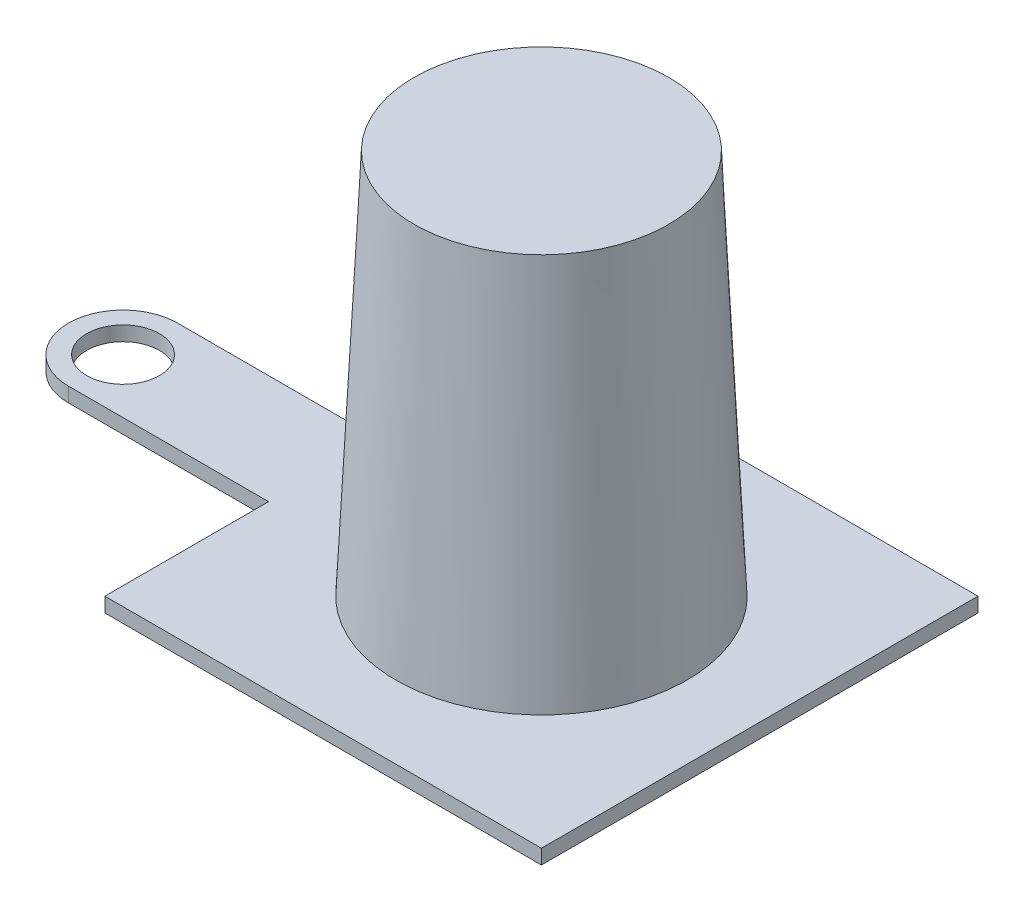
ISO-10303-21;
HEADER;
FILE_DESCRIPTION(('STEP AP214'),'2;1');
FILE_NAME('part.step','',(''),(''),'','','');
FILE_SCHEMA(('AUTOMOTIVE_DESIGN { 1 0 10303 214 1 1 1 1 }'));
ENDSEC;
DATA;
#1=APPLICATION_CONTEXT('core data for automotive mechanical design processes');
#2=APPLICATION_PROTOCOL_DEFINITION('international standard','automotive_design',2000,#1);
#3=PRODUCT_CONTEXT('',#1,'mechanical');
#4=PRODUCT('Part','Part','',(#3));
#5=PRODUCT_RELATED_PRODUCT_CATEGORY('part','',(#4));
#6=PRODUCT_DEFINITION_FORMATION('','',#4);
#7=PRODUCT_DEFINITION_CONTEXT('part definition',#1,'design');
#8=PRODUCT_DEFINITION('design','',#6,#7);
#9=PRODUCT_DEFINITION_SHAPE('','',#8);
#10=(LENGTH_UNIT() NAMED_UNIT(*) SI_UNIT(.MILLI.,.METRE.));
#11=(NAMED_UNIT(*) PLANE_ANGLE_UNIT() SI_UNIT($,.RADIAN.));
#12=(NAMED_UNIT(*) SI_UNIT($,.STERADIAN.) SOLID_ANGLE_UNIT());
#13=UNCERTAINTY_MEASURE_WITH_UNIT(LENGTH_MEASURE(1.E-05),#10,'distance_accuracy_value','');
#14=(GEOMETRIC_REPRESENTATION_CONTEXT(3) GLOBAL_UNCERTAINTY_ASSIGNED_CONTEXT((#13)) GLOBAL_UNIT_ASSIGNED_CONTEXT((#10,
#11,#12)) REPRESENTATION_CONTEXT('',''));
#15=CARTESIAN_POINT('',(0.,0.,0.));
#16=DIRECTION('',(0.,0.,1.));
#17=DIRECTION('',(1.,0.,0.));
#18=AXIS2_PLACEMENT_3D('',#15,#16,#17);
#19=CARTESIAN_POINT('',(6.,0.4,6.));
#20=DIRECTION('',(-1.,0.,0.));
#21=DIRECTION('',(0.,0.,1.));
#22=AXIS2_PLACEMENT_3D('',#19,#20,#21);
#23=PLANE('',#22);
#24=DIRECTION('',(0.,0.,-1.));
#25=VECTOR('',#24,1.);
#26=CARTESIAN_POINT('',(6.,0.,6.));
#27=LINE('',#26,#25);
#28=CARTESIAN_POINT('',(6.,0.,6.));
#29=VERTEX_POINT('',#28);
#30=CARTESIAN_POINT('',(6.,0.,-6.));
#31=VERTEX_POINT('',#30);
#32=EDGE_CURVE('E185',#29,#31,#27,.T.);
#33=ORIENTED_EDGE('',*,*,#32,.T.);
#34=DIRECTION('',(0.,-1.,0.));
#35=VECTOR('',#34,1.);
#36=CARTESIAN_POINT('',(6.,0.4,-6.));
#37=LINE('',#36,#35);
#38=CARTESIAN_POINT('',(6.,0.4,-6.));
#39=VERTEX_POINT('',#38);
#40=EDGE_CURVE('E166',#39,#31,#37,.T.);
#41=ORIENTED_EDGE('',*,*,#40,.F.);
#42=DIRECTION('',(0.,0.,-1.));
#43=VECTOR('',#42,1.);
#44=CARTESIAN_POINT('',(6.,0.4,6.));
#45=LINE('',#44,#43);
#46=CARTESIAN_POINT('',(6.,0.4,6.));
#47=VERTEX_POINT('',#46);
#48=EDGE_CURVE('E172',#47,#39,#45,.T.);
#49=ORIENTED_EDGE('',*,*,#48,.F.);
#50=DIRECTION('',(0.,-1.,0.));
#51=VECTOR('',#50,1.);
#52=CARTESIAN_POINT('',(6.,0.4,6.));
#53=LINE('',#52,#51);
#54=EDGE_CURVE('E192',#47,#29,#53,.T.);
#55=ORIENTED_EDGE('',*,*,#54,.T.);
#56=EDGE_LOOP('',(#33,#41,#49,#55));
#57=FACE_BOUND('',#56,.T.);
#58=ADVANCED_FACE('F77',(#57),#23,.F.);
#59=CARTESIAN_POINT('',(-6.,0.4,-6.));
#60=DIRECTION('',(0.,0.,-1.));
#61=DIRECTION('',(-1.,0.,0.));
#62=AXIS2_PLACEMENT_3D('',#59,#60,#61);
#63=PLANE('',#62);
#64=DIRECTION('',(1.,0.,0.));
#65=VECTOR('',#64,1.);
#66=CARTESIAN_POINT('',(-6.,0.,-6.));
#67=LINE('',#66,#65);
#68=CARTESIAN_POINT('',(-6.,0.,-6.));
#69=VERTEX_POINT('',#68);
#70=EDGE_CURVE('E165',#69,#31,#67,.T.);
#71=ORIENTED_EDGE('',*,*,#70,.F.);
#72=DIRECTION('',(0.,-1.,0.));
#73=VECTOR('',#72,1.);
#74=CARTESIAN_POINT('',(-6.,0.4,-6.));
#75=LINE('',#74,#73);
#76=CARTESIAN_POINT('',(-6.,0.4,-6.));
#77=VERTEX_POINT('',#76);
#78=EDGE_CURVE('E153',#77,#69,#75,.T.);
#79=ORIENTED_EDGE('',*,*,#78,.F.);
#80=DIRECTION('',(1.,0.,0.));
#81=VECTOR('',#80,1.);
#82=CARTESIAN_POINT('',(-6.,0.4,-6.));
#83=LINE('',#82,#81);
#84=EDGE_CURVE('E163',#77,#39,#83,.T.);
#85=ORIENTED_EDGE('',*,*,#84,.T.);
#86=ORIENTED_EDGE('',*,*,#40,.T.);
#87=EDGE_LOOP('',(#71,#79,#85,#86));
#88=FACE_BOUND('',#87,.T.);
#89=ADVANCED_FACE('F162',(#88),#63,.T.);
#90=CARTESIAN_POINT('',(-6.,0.4,6.));
#91=DIRECTION('',(0.,0.,-1.));
#92=DIRECTION('',(-1.,0.,0.));
#93=AXIS2_PLACEMENT_3D('',#90,#91,#92);
#94=PLANE('',#93);
#95=DIRECTION('',(1.,0.,0.));
#96=VECTOR('',#95,1.);
#97=CARTESIAN_POINT('',(-6.,0.,6.));
#98=LINE('',#97,#96);
#99=CARTESIAN_POINT('',(-6.,0.,6.));
#100=VERTEX_POINT('',#99);
#101=EDGE_CURVE('E158',#100,#29,#98,.T.);
#102=ORIENTED_EDGE('',*,*,#101,.T.);
#103=ORIENTED_EDGE('',*,*,#54,.F.);
#104=DIRECTION('',(1.,0.,0.));
#105=VECTOR('',#104,1.);
#106=CARTESIAN_POINT('',(-6.,0.4,6.));
#107=LINE('',#106,#105);
#108=CARTESIAN_POINT('',(-6.,0.4,6.));
#109=VERTEX_POINT('',#108);
#110=EDGE_CURVE('E167',#109,#47,#107,.T.);
#111=ORIENTED_EDGE('',*,*,#110,.F.);
#112=DIRECTION('',(0.,-1.,0.));
#113=VECTOR('',#112,1.);
#114=CARTESIAN_POINT('',(-6.,0.4,6.));
#115=LINE('',#114,#113);
#116=EDGE_CURVE('E189',#109,#100,#115,.T.);
#117=ORIENTED_EDGE('',*,*,#116,.T.);
#118=EDGE_LOOP('',(#102,#103,#111,#117));
#119=FACE_BOUND('',#118,.T.);
#120=ADVANCED_FACE('F259',(#119),#94,.F.);
#121=CARTESIAN_POINT('',(0.,0.,0.));
#122=DIRECTION('',(0.,-1.,0.));
#123=DIRECTION('',(0.,0.,-1.));
#124=AXIS2_PLACEMENT_3D('',#121,#122,#123);
#125=PLANE('',#124);
#126=DIRECTION('',(-1.,0.,0.));
#127=VECTOR('',#126,1.);
#128=CARTESIAN_POINT('',(-6.,0.,1.5));
#129=LINE('',#128,#127);
#130=CARTESIAN_POINT('',(-6.,0.,1.5));
#131=VERTEX_POINT('',#130);
#132=CARTESIAN_POINT('',(-11.5,0.,1.5));
#133=VERTEX_POINT('',#132);
#134=EDGE_CURVE('E199',#131,#133,#129,.T.);
#135=ORIENTED_EDGE('',*,*,#134,.T.);
#136=CARTESIAN_POINT('',(-11.5,0.,0.));
#137=DIRECTION('',(0.,-1.,0.));
#138=DIRECTION('',(0.,0.,-1.));
#139=AXIS2_PLACEMENT_3D('',#136,#137,#138);
#140=CIRCLE('',#139,1.5);
#141=CARTESIAN_POINT('',(-13.,0.,0.));
#142=VERTEX_POINT('',#141);
#143=EDGE_CURVE('E225',#133,#142,#140,.T.);
#144=ORIENTED_EDGE('',*,*,#143,.T.);
#145=CARTESIAN_POINT('',(-11.5,0.,0.));
#146=DIRECTION('',(0.,-1.,0.));
#147=DIRECTION('',(0.,0.,-1.));
#148=AXIS2_PLACEMENT_3D('',#145,#146,#147);
#149=CIRCLE('',#148,1.5);
#150=CARTESIAN_POINT('',(-11.5,0.,-1.5));
#151=VERTEX_POINT('',#150);
#152=EDGE_CURVE('E223',#142,#151,#149,.T.);
#153=ORIENTED_EDGE('',*,*,#152,.T.);
#154=DIRECTION('',(-1.,0.,0.));
#155=VECTOR('',#154,1.);
#156=CARTESIAN_POINT('',(-6.,0.,-1.5));
#157=LINE('',#156,#155);
#158=CARTESIAN_POINT('',(-6.,0.,-1.5));
#159=VERTEX_POINT('',#158);
#160=EDGE_CURVE('E208',#159,#151,#157,.T.);
#161=ORIENTED_EDGE('',*,*,#160,.F.);
#162=DIRECTION('',(0.,0.,-1.));
#163=VECTOR('',#162,1.);
#164=CARTESIAN_POINT('',(-6.,0.,6.));
#165=LINE('',#164,#163);
#166=EDGE_CURVE('E183',#159,#69,#165,.T.);
#167=ORIENTED_EDGE('',*,*,#166,.T.);
#168=ORIENTED_EDGE('',*,*,#70,.T.);
#169=ORIENTED_EDGE('',*,*,#32,.F.);
#170=ORIENTED_EDGE('',*,*,#101,.F.);
#171=EDGE_CURVE('E180',#100,#131,#165,.T.);
#172=ORIENTED_EDGE('',*,*,#171,.T.);
#173=EDGE_LOOP('',(#135,#144,#153,#161,#167,#168,#169,#170,#172));
#174=FACE_BOUND('',#173,.T.);
#175=CARTESIAN_POINT('',(-11.5,0.,0.));
#176=DIRECTION('',(0.,1.,0.));
#177=DIRECTION('',(0.,0.,1.));
#178=AXIS2_PLACEMENT_3D('',#175,#176,#177);
#179=CIRCLE('',#178,1.);
#180=CARTESIAN_POINT('',(-11.5,0.,1.));
#181=VERTEX_POINT('',#180);
#182=EDGE_CURVE('E200',#181,#181,#179,.T.);
#183=ORIENTED_EDGE('',*,*,#182,.T.);
#184=EDGE_LOOP('',(#183));
#185=FACE_BOUND('',#184,.T.);
#186=ADVANCED_FACE('F240',(#174,#185),#125,.T.);
#187=CARTESIAN_POINT('',(0.,0.4,0.));
#188=DIRECTION('',(0.,-1.,0.));
#189=DIRECTION('',(0.,0.,-1.));
#190=AXIS2_PLACEMENT_3D('',#187,#188,#189);
#191=PLANE('',#190);
#192=CARTESIAN_POINT('',(0.,0.399999999999999,0.));
#193=DIRECTION('',(0.,-1.,0.));
#194=DIRECTION('',(0.,0.,-1.));
#195=AXIS2_PLACEMENT_3D('',#192,#193,#194);
#196=CIRCLE('',#195,4.);
#197=CARTESIAN_POINT('',(0.,0.399999999999999,-4.));
#198=VERTEX_POINT('',#197);
#199=EDGE_CURVE('E216',#198,#198,#196,.T.);
#200=ORIENTED_EDGE('',*,*,#199,.T.);
#201=EDGE_LOOP('',(#200));
#202=FACE_BOUND('',#201,.T.);
#203=CARTESIAN_POINT('',(-11.5,0.4,0.));
#204=DIRECTION('',(0.,-1.,0.));
#205=DIRECTION('',(0.,0.,-1.));
#206=AXIS2_PLACEMENT_3D('',#203,#204,#205);
#207=CIRCLE('',#206,1.5);
#208=CARTESIAN_POINT('',(-11.5,0.4,-1.5));
#209=VERTEX_POINT('',#208);
#210=CARTESIAN_POINT('',(-13.,0.4,0.));
#211=VERTEX_POINT('',#210);
#212=EDGE_CURVE('E93',#209,#211,#207,.F.);
#213=ORIENTED_EDGE('',*,*,#212,.T.);
#214=CARTESIAN_POINT('',(-11.5,0.4,0.));
#215=DIRECTION('',(0.,-1.,0.));
#216=DIRECTION('',(0.,0.,-1.));
#217=AXIS2_PLACEMENT_3D('',#214,#215,#216);
#218=CIRCLE('',#217,1.5);
#219=CARTESIAN_POINT('',(-11.5,0.4,1.5));
#220=VERTEX_POINT('',#219);
#221=EDGE_CURVE('E86',#211,#220,#218,.F.);
#222=ORIENTED_EDGE('',*,*,#221,.T.);
#223=DIRECTION('',(-1.,0.,0.));
#224=VECTOR('',#223,1.);
#225=CARTESIAN_POINT('',(-6.,0.4,1.5));
#226=LINE('',#225,#224);
#227=CARTESIAN_POINT('',(-6.,0.4,1.5));
#228=VERTEX_POINT('',#227);
#229=EDGE_CURVE('E204',#228,#220,#226,.T.);
#230=ORIENTED_EDGE('',*,*,#229,.F.);
#231=DIRECTION('',(0.,0.,-1.));
#232=VECTOR('',#231,1.);
#233=CARTESIAN_POINT('',(-6.,0.4,6.));
#234=LINE('',#233,#232);
#235=EDGE_CURVE('E157',#109,#228,#234,.T.);
#236=ORIENTED_EDGE('',*,*,#235,.F.);
#237=ORIENTED_EDGE('',*,*,#110,.T.);
#238=ORIENTED_EDGE('',*,*,#48,.T.);
#239=ORIENTED_EDGE('',*,*,#84,.F.);
#240=CARTESIAN_POINT('',(-6.,0.4,-1.5));
#241=VERTEX_POINT('',#240);
#242=EDGE_CURVE('E149',#241,#77,#234,.T.);
#243=ORIENTED_EDGE('',*,*,#242,.F.);
#244=DIRECTION('',(-1.,0.,0.));
#245=VECTOR('',#244,1.);
#246=CARTESIAN_POINT('',(-6.,0.4,-1.5));
#247=LINE('',#246,#245);
#248=EDGE_CURVE('E207',#241,#209,#247,.T.);
#249=ORIENTED_EDGE('',*,*,#248,.T.);
#250=EDGE_LOOP('',(#213,#222,#230,#236,#237,#238,#239,#243,#249));
#251=FACE_BOUND('',#250,.T.);
#252=CARTESIAN_POINT('',(-11.5,0.4,0.));
#253=DIRECTION('',(0.,1.,0.));
#254=DIRECTION('',(0.,0.,1.));
#255=AXIS2_PLACEMENT_3D('',#252,#253,#254);
#256=CIRCLE('',#255,1.);
#257=CARTESIAN_POINT('',(-11.5,0.4,1.));
#258=VERTEX_POINT('',#257);
#259=EDGE_CURVE('E196',#258,#258,#256,.T.);
#260=ORIENTED_EDGE('',*,*,#259,.F.);
#261=EDGE_LOOP('',(#260));
#262=FACE_BOUND('',#261,.T.);
#263=ADVANCED_FACE('F169',(#202,#251,#262),#191,.F.);
#264=CARTESIAN_POINT('',(-6.,0.4,6.));
#265=DIRECTION('',(-1.,0.,0.));
#266=DIRECTION('',(0.,0.,1.));
#267=AXIS2_PLACEMENT_3D('',#264,#265,#266);
#268=PLANE('',#267);
#269=ORIENTED_EDGE('',*,*,#235,.T.);
#270=DIRECTION('',(0.,-1.,0.));
#271=VECTOR('',#270,1.);
#272=CARTESIAN_POINT('',(-6.,0.4,1.5));
#273=LINE('',#272,#271);
#274=EDGE_CURVE('E191',#228,#131,#273,.T.);
#275=ORIENTED_EDGE('',*,*,#274,.T.);
#276=ORIENTED_EDGE('',*,*,#171,.F.);
#277=ORIENTED_EDGE('',*,*,#116,.F.);
#278=EDGE_LOOP('',(#269,#275,#276,#277));
#279=FACE_BOUND('',#278,.T.);
#280=ADVANCED_FACE('F267',(#279),#268,.T.);
#281=DIRECTION('',(0.,-1.,0.));
#282=VECTOR('',#281,1.);
#283=CARTESIAN_POINT('',(-6.,0.4,-1.5));
#284=LINE('',#283,#282);
#285=EDGE_CURVE('E155',#241,#159,#284,.T.);
#286=ORIENTED_EDGE('',*,*,#285,.F.);
#287=ORIENTED_EDGE('',*,*,#242,.T.);
#288=ORIENTED_EDGE('',*,*,#78,.T.);
#289=ORIENTED_EDGE('',*,*,#166,.F.);
#290=EDGE_LOOP('',(#286,#287,#288,#289));
#291=FACE_BOUND('',#290,.T.);
#292=ADVANCED_FACE('F151',(#291),#268,.T.);
#293=CARTESIAN_POINT('',(-11.5,0.4,0.));
#294=DIRECTION('',(0.,-1.,0.));
#295=DIRECTION('',(0.,0.,-1.));
#296=AXIS2_PLACEMENT_3D('',#293,#294,#295);
#297=CYLINDRICAL_SURFACE('',#296,1.);
#298=ORIENTED_EDGE('',*,*,#259,.T.);
#299=EDGE_LOOP('',(#298));
#300=FACE_BOUND('',#299,.T.);
#301=ORIENTED_EDGE('',*,*,#182,.F.);
#302=EDGE_LOOP('',(#301));
#303=FACE_BOUND('',#302,.T.);
#304=ADVANCED_FACE('F266',(#300,#303),#297,.F.);
#305=CARTESIAN_POINT('',(-6.,0.4,1.5));
#306=DIRECTION('',(0.,0.,1.));
#307=DIRECTION('',(1.,0.,0.));
#308=AXIS2_PLACEMENT_3D('',#305,#306,#307);
#309=PLANE('',#308);
#310=ORIENTED_EDGE('',*,*,#229,.T.);
#311=DIRECTION('',(0.,-1.,0.));
#312=VECTOR('',#311,1.);
#313=CARTESIAN_POINT('',(-11.5,0.,1.5));
#314=LINE('',#313,#312);
#315=EDGE_CURVE('E214',#220,#133,#314,.T.);
#316=ORIENTED_EDGE('',*,*,#315,.T.);
#317=ORIENTED_EDGE('',*,*,#134,.F.);
#318=ORIENTED_EDGE('',*,*,#274,.F.);
#319=EDGE_LOOP('',(#310,#316,#317,#318));
#320=FACE_BOUND('',#319,.T.);
#321=ADVANCED_FACE('F235',(#320),#309,.T.);
#322=CARTESIAN_POINT('',(-6.,0.4,-1.5));
#323=DIRECTION('',(0.,0.,1.));
#324=DIRECTION('',(1.,0.,0.));
#325=AXIS2_PLACEMENT_3D('',#322,#323,#324);
#326=PLANE('',#325);
#327=ORIENTED_EDGE('',*,*,#160,.T.);
#328=DIRECTION('',(0.,-1.,0.));
#329=VECTOR('',#328,1.);
#330=CARTESIAN_POINT('',(-11.5,0.4,-1.5));
#331=LINE('',#330,#329);
#332=EDGE_CURVE('E12',#151,#209,#331,.F.);
#333=ORIENTED_EDGE('',*,*,#332,.T.);
#334=ORIENTED_EDGE('',*,*,#248,.F.);
#335=ORIENTED_EDGE('',*,*,#285,.T.);
#336=EDGE_LOOP('',(#327,#333,#334,#335));
#337=FACE_BOUND('',#336,.T.);
#338=ADVANCED_FACE('F268',(#337),#326,.F.);
#339=CARTESIAN_POINT('',(0.,11.,0.));
#340=DIRECTION('',(0.,-1.,0.));
#341=DIRECTION('',(0.,0.,-1.));
#342=AXIS2_PLACEMENT_3D('',#339,#340,#341);
#343=CONICAL_SURFACE('',#342,3.5,0.0471348738135006);
#344=CARTESIAN_POINT('',(0.,11.,0.));
#345=DIRECTION('',(0.,-1.,0.));
#346=DIRECTION('',(0.,0.,-1.));
#347=AXIS2_PLACEMENT_3D('',#344,#345,#346);
#348=CIRCLE('',#347,3.5);
#349=CARTESIAN_POINT('',(0.,11.,-3.5));
#350=VERTEX_POINT('',#349);
#351=EDGE_CURVE('E203',#350,#350,#348,.T.);
#352=ORIENTED_EDGE('',*,*,#351,.T.);
#353=EDGE_LOOP('',(#352));
#354=FACE_BOUND('',#353,.T.);
#355=ORIENTED_EDGE('',*,*,#199,.F.);
#356=EDGE_LOOP('',(#355));
#357=FACE_BOUND('',#356,.T.);
#358=ADVANCED_FACE('F250',(#354,#357),#343,.T.);
#359=CARTESIAN_POINT('',(0.,11.,0.));
#360=DIRECTION('',(0.,-1.,0.));
#361=DIRECTION('',(0.,0.,-1.));
#362=AXIS2_PLACEMENT_3D('',#359,#360,#361);
#363=PLANE('',#362);
#364=ORIENTED_EDGE('',*,*,#351,.F.);
#365=EDGE_LOOP('',(#364));
#366=FACE_BOUND('',#365,.T.);
#367=ADVANCED_FACE('F245',(#366),#363,.F.);
#368=CARTESIAN_POINT('',(-11.5,0.4,0.));
#369=DIRECTION('',(0.,-1.,0.));
#370=DIRECTION('',(0.,0.,-1.));
#371=AXIS2_PLACEMENT_3D('',#368,#369,#370);
#372=CYLINDRICAL_SURFACE('',#371,1.5);
#373=DIRECTION('',(0.,-1.,0.));
#374=VECTOR('',#373,1.);
#375=CARTESIAN_POINT('',(-13.,0.4,0.));
#376=LINE('',#375,#374);
#377=EDGE_CURVE('E81',#211,#142,#376,.T.);
#378=ORIENTED_EDGE('',*,*,#377,.F.);
#379=ORIENTED_EDGE('',*,*,#212,.F.);
#380=ORIENTED_EDGE('',*,*,#332,.F.);
#381=ORIENTED_EDGE('',*,*,#152,.F.);
#382=EDGE_LOOP('',(#378,#379,#380,#381));
#383=FACE_BOUND('',#382,.T.);
#384=ADVANCED_FACE('F79',(#383),#372,.T.);
#385=CARTESIAN_POINT('',(-11.5,0.4,0.));
#386=DIRECTION('',(0.,1.,0.));
#387=DIRECTION('',(0.,0.,1.));
#388=AXIS2_PLACEMENT_3D('',#385,#386,#387);
#389=CYLINDRICAL_SURFACE('',#388,1.5);
#390=ORIENTED_EDGE('',*,*,#221,.F.);
#391=ORIENTED_EDGE('',*,*,#377,.T.);
#392=ORIENTED_EDGE('',*,*,#143,.F.);
#393=ORIENTED_EDGE('',*,*,#315,.F.);
#394=EDGE_LOOP('',(#390,#391,#392,#393));
#395=FACE_BOUND('',#394,.T.);
#396=ADVANCED_FACE('F237',(#395),#389,.T.);
#397=CLOSED_SHELL('',(#58,#89,#120,#186,#263,#280,#292,#304,#321,#338,#358,#367,#384,#396));
#398=MANIFOLD_SOLID_BREP('B2',#397);
#399=ADVANCED_BREP_SHAPE_REPRESENTATION('',(#18,#398),#14);
#400=SHAPE_DEFINITION_REPRESENTATION(#9,#399);
ENDSEC;
END-ISO-10303-21;
